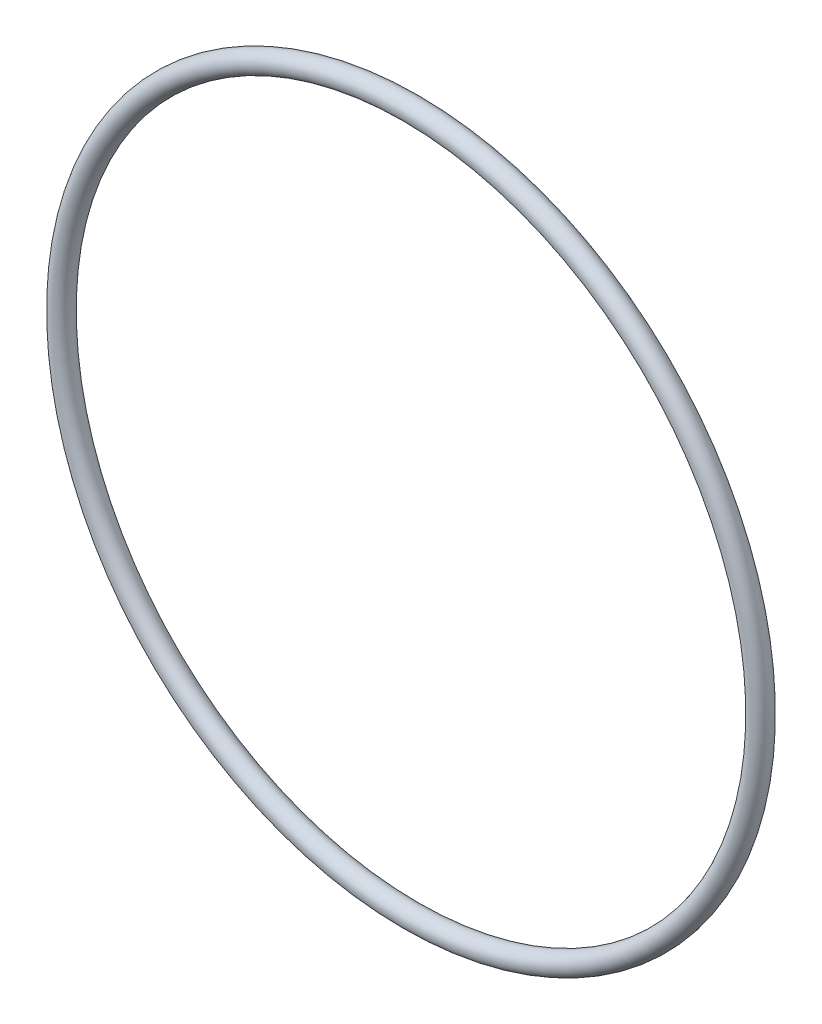
ISO-10303-21;
HEADER;
FILE_DESCRIPTION(('STEP AP214'),'2;1');
FILE_NAME('part.step','',(''),(''),'','','');
FILE_SCHEMA(('AUTOMOTIVE_DESIGN { 1 0 10303 214 1 1 1 1 }'));
ENDSEC;
DATA;
#1=APPLICATION_CONTEXT('core data for automotive mechanical design processes');
#2=APPLICATION_PROTOCOL_DEFINITION('international standard','automotive_design',2000,#1);
#3=PRODUCT_CONTEXT('',#1,'mechanical');
#4=PRODUCT('Part','Part','',(#3));
#5=PRODUCT_RELATED_PRODUCT_CATEGORY('part','',(#4));
#6=PRODUCT_DEFINITION_FORMATION('','',#4);
#7=PRODUCT_DEFINITION_CONTEXT('part definition',#1,'design');
#8=PRODUCT_DEFINITION('design','',#6,#7);
#9=PRODUCT_DEFINITION_SHAPE('','',#8);
#10=(LENGTH_UNIT() NAMED_UNIT(*) SI_UNIT(.MILLI.,.METRE.));
#11=(NAMED_UNIT(*) PLANE_ANGLE_UNIT() SI_UNIT($,.RADIAN.));
#12=(NAMED_UNIT(*) SI_UNIT($,.STERADIAN.) SOLID_ANGLE_UNIT());
#13=UNCERTAINTY_MEASURE_WITH_UNIT(LENGTH_MEASURE(1.E-05),#10,'distance_accuracy_value','');
#14=(GEOMETRIC_REPRESENTATION_CONTEXT(3) GLOBAL_UNCERTAINTY_ASSIGNED_CONTEXT((#13)) GLOBAL_UNIT_ASSIGNED_CONTEXT((#10,
#11,#12)) REPRESENTATION_CONTEXT('',''));
#15=CARTESIAN_POINT('',(0.,0.,0.));
#16=DIRECTION('',(0.,0.,1.));
#17=DIRECTION('',(1.,0.,0.));
#18=AXIS2_PLACEMENT_3D('',#15,#16,#17);
#19=CARTESIAN_POINT('',(0.,0.,0.));
#20=DIRECTION('',(0.,0.,-1.));
#21=DIRECTION('',(-1.,0.,0.));
#22=AXIS2_PLACEMENT_3D('',#19,#20,#21);
#23=TOROIDAL_SURFACE('',#22,50.,1.5);
#24=CARTESIAN_POINT('',(0.,50.,0.));
#25=DIRECTION('',(1.,0.,0.));
#26=DIRECTION('',(0.,0.,-1.));
#27=AXIS2_PLACEMENT_3D('',#24,#25,#26);
#28=CIRCLE('',#27,1.5);
#29=CARTESIAN_POINT('',(0.,51.5,0.));
#30=VERTEX_POINT('',#29);
#31=EDGE_CURVE('E10',#30,#30,#28,.T.);
#32=CARTESIAN_POINT('',(0.,0.,0.));
#33=DIRECTION('',(0.,0.,-1.));
#34=DIRECTION('',(-1.,0.,0.));
#35=AXIS2_PLACEMENT_3D('',#32,#33,#34);
#36=CIRCLE('',#35,51.5);
#37=EDGE_CURVE('',#30,#30,#36,.T.);
#38=ORIENTED_EDGE('',*,*,#31,.T.);
#39=ORIENTED_EDGE('',*,*,#31,.F.);
#40=ORIENTED_EDGE('',*,*,#37,.T.);
#41=ORIENTED_EDGE('',*,*,#37,.F.);
#42=EDGE_LOOP('',(#38,#40,#39,#41));
#43=FACE_BOUND('',#42,.T.);
#44=ADVANCED_FACE('F32',(#43),#23,.T.);
#45=CLOSED_SHELL('',(#44));
#46=MANIFOLD_SOLID_BREP('B2',#45);
#47=ADVANCED_BREP_SHAPE_REPRESENTATION('',(#18,#46),#14);
#48=SHAPE_DEFINITION_REPRESENTATION(#9,#47);
ENDSEC;
END-ISO-10303-21;
